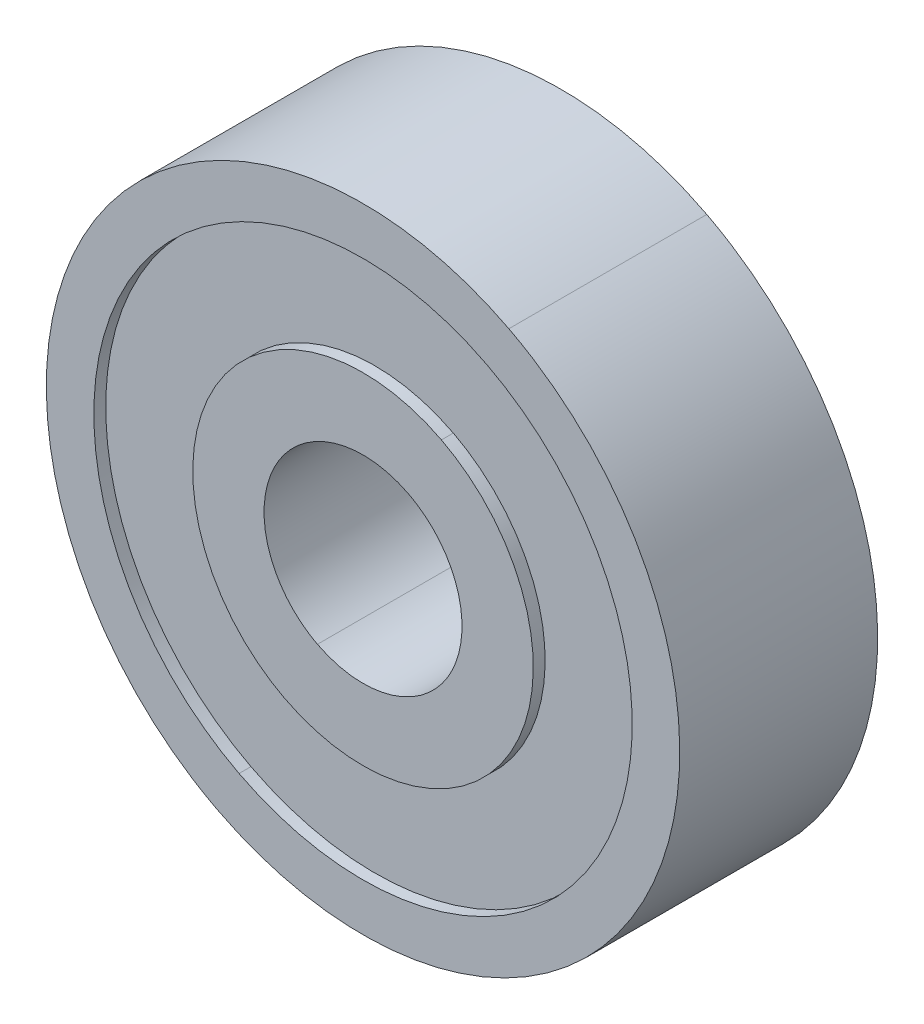
ISO-10303-21;
HEADER;
FILE_DESCRIPTION(('STEP AP214'),'2;1');
FILE_NAME('part.step','',(''),(''),'','','');
FILE_SCHEMA(('AUTOMOTIVE_DESIGN { 1 0 10303 214 1 1 1 1 }'));
ENDSEC;
DATA;
#1=APPLICATION_CONTEXT('core data for automotive mechanical design processes');
#2=APPLICATION_PROTOCOL_DEFINITION('international standard','automotive_design',2000,#1);
#3=PRODUCT_CONTEXT('',#1,'mechanical');
#4=PRODUCT('Part','Part','',(#3));
#5=PRODUCT_RELATED_PRODUCT_CATEGORY('part','',(#4));
#6=PRODUCT_DEFINITION_FORMATION('','',#4);
#7=PRODUCT_DEFINITION_CONTEXT('part definition',#1,'design');
#8=PRODUCT_DEFINITION('design','',#6,#7);
#9=PRODUCT_DEFINITION_SHAPE('','',#8);
#10=(LENGTH_UNIT() NAMED_UNIT(*) SI_UNIT(.MILLI.,.METRE.));
#11=(NAMED_UNIT(*) PLANE_ANGLE_UNIT() SI_UNIT($,.RADIAN.));
#12=(NAMED_UNIT(*) SI_UNIT($,.STERADIAN.) SOLID_ANGLE_UNIT());
#13=UNCERTAINTY_MEASURE_WITH_UNIT(LENGTH_MEASURE(1.E-05),#10,'distance_accuracy_value','');
#14=(GEOMETRIC_REPRESENTATION_CONTEXT(3) GLOBAL_UNCERTAINTY_ASSIGNED_CONTEXT((#13)) GLOBAL_UNIT_ASSIGNED_CONTEXT((#10,
#11,#12)) REPRESENTATION_CONTEXT('',''));
#15=CARTESIAN_POINT('',(0.,0.,0.));
#16=DIRECTION('',(0.,0.,1.));
#17=DIRECTION('',(1.,0.,0.));
#18=AXIS2_PLACEMENT_3D('',#15,#16,#17);
#19=CARTESIAN_POINT('',(168.364061599872,-426.296506317955,250.381305856301));
#20=CARTESIAN_POINT('',(170.583226360934,-427.447726437334,250.381305856301));
#21=CARTESIAN_POINT('',(171.734446480313,-425.228561676273,250.381305856301));
#22=CARTESIAN_POINT('',(172.885666599692,-423.009396915211,250.381305856301));
#23=CARTESIAN_POINT('',(170.666501838631,-421.858176795832,250.381305856301));
#24=CARTESIAN_POINT('',(168.364061599872,-426.296506317955,255.381305856301));
#25=CARTESIAN_POINT('',(170.583226360934,-427.447726437334,255.381305856301));
#26=CARTESIAN_POINT('',(171.734446480313,-425.228561676273,255.381305856301));
#27=CARTESIAN_POINT('',(172.885666599692,-423.009396915211,255.381305856301));
#28=CARTESIAN_POINT('',(170.666501838631,-421.858176795832,255.381305856301));
#29=(BOUNDED_SURFACE() B_SPLINE_SURFACE(1,2,((#19,#20,#21,#22,#23),(#24,#25,#26,#27,#28)),
.UNSPECIFIED.,.F.,.F.,.F.) B_SPLINE_SURFACE_WITH_KNOTS((2,2),(3,2,3),(-2.5,2.5),
(1.5707963267949,3.14159265358979,4.71238898038469),
.UNSPECIFIED.) GEOMETRIC_REPRESENTATION_ITEM() RATIONAL_B_SPLINE_SURFACE(((1.,0.707106781186548,
1.,0.707106781186548,1.),(1.,0.707106781186548,1.,0.707106781186548,1.))) REPRESENTATION_ITEM('') SURFACE());
#30=CARTESIAN_POINT('',(170.666501838631,-421.858176795832,250.381305856301));
#31=CARTESIAN_POINT('',(170.666501838631,-421.858176795832,255.381305856301));
#32=(BOUNDED_CURVE() B_SPLINE_CURVE(1,(#30,#31),.UNSPECIFIED.,.F.,
.F.) B_SPLINE_CURVE_WITH_KNOTS((2,2),(0.,5.),
.UNSPECIFIED.) CURVE() GEOMETRIC_REPRESENTATION_ITEM() RATIONAL_B_SPLINE_CURVE((1.,1.)) REPRESENTATION_ITEM(''));
#33=CARTESIAN_POINT('',(170.666501838631,-421.858176795832,250.381305856301));
#34=VERTEX_POINT('',#33);
#35=CARTESIAN_POINT('',(170.666501838631,-421.858176795832,255.381305856301));
#36=VERTEX_POINT('',#35);
#37=EDGE_CURVE('E56',#34,#36,#32,.T.);
#38=CARTESIAN_POINT('',(168.364061599872,-426.296506317955,250.381305856301));
#39=CARTESIAN_POINT('',(170.583226360934,-427.447726437334,250.381305856301));
#40=CARTESIAN_POINT('',(171.734446480313,-425.228561676273,250.381305856301));
#41=CARTESIAN_POINT('',(172.885666599692,-423.009396915212,250.381305856301));
#42=CARTESIAN_POINT('',(170.666501838631,-421.858176795832,250.381305856301));
#43=(BOUNDED_CURVE() B_SPLINE_CURVE(2,(#38,#39,#40,#41,#42),.UNSPECIFIED.,.F.,
.F.) B_SPLINE_CURVE_WITH_KNOTS((3,2,3),(0.,3.92699081698724,7.85398163397448),
.UNSPECIFIED.) CURVE() GEOMETRIC_REPRESENTATION_ITEM() RATIONAL_B_SPLINE_CURVE((1.,
0.707106781186548,1.,0.707106781186548,1.)) REPRESENTATION_ITEM(''));
#44=CARTESIAN_POINT('',(168.364061599872,-426.296506317955,250.381305856301));
#45=VERTEX_POINT('',#44);
#46=EDGE_CURVE('E191',#45,#34,#43,.T.);
#47=CARTESIAN_POINT('',(168.364061599872,-426.296506317955,250.381305856301));
#48=CARTESIAN_POINT('',(168.364061599872,-426.296506317955,255.381305856301));
#49=(BOUNDED_CURVE() B_SPLINE_CURVE(1,(#47,#48),.UNSPECIFIED.,.F.,
.F.) B_SPLINE_CURVE_WITH_KNOTS((2,2),(0.,5.),
.UNSPECIFIED.) CURVE() GEOMETRIC_REPRESENTATION_ITEM() RATIONAL_B_SPLINE_CURVE((1.,1.)) REPRESENTATION_ITEM(''));
#50=CARTESIAN_POINT('',(168.364061599872,-426.296506317955,255.381305856301));
#51=VERTEX_POINT('',#50);
#52=EDGE_CURVE('E11',#45,#51,#49,.T.);
#53=CARTESIAN_POINT('',(168.364061599872,-426.296506317955,255.381305856301));
#54=CARTESIAN_POINT('',(170.583226360934,-427.447726437334,255.381305856301));
#55=CARTESIAN_POINT('',(171.734446480313,-425.228561676273,255.381305856301));
#56=CARTESIAN_POINT('',(172.885666599692,-423.009396915212,255.381305856301));
#57=CARTESIAN_POINT('',(170.666501838631,-421.858176795832,255.381305856301));
#58=(BOUNDED_CURVE() B_SPLINE_CURVE(2,(#53,#54,#55,#56,#57),.UNSPECIFIED.,.F.,
.F.) B_SPLINE_CURVE_WITH_KNOTS((3,2,3),(0.,3.92699081698724,7.85398163397448),
.UNSPECIFIED.) CURVE() GEOMETRIC_REPRESENTATION_ITEM() RATIONAL_B_SPLINE_CURVE((1.,
0.707106781186548,1.,0.707106781186548,1.)) REPRESENTATION_ITEM(''));
#59=EDGE_CURVE('E469',#51,#36,#58,.T.);
#60=ORIENTED_EDGE('',*,*,#37,.F.);
#61=ORIENTED_EDGE('',*,*,#46,.F.);
#62=ORIENTED_EDGE('',*,*,#52,.T.);
#63=ORIENTED_EDGE('',*,*,#59,.T.);
#64=EDGE_LOOP('',(#60,#61,#62,#63));
#65=FACE_BOUND('',#64,.T.);
#66=ADVANCED_FACE('F51',(#65),#29,.T.);
#67=CARTESIAN_POINT('',(167.535183113919,-427.894304945919,255.081305856301));
#68=CARTESIAN_POINT('',(167.535183113919,-427.894304945919,255.381305856301));
#69=CARTESIAN_POINT('',(171.352146502945,-429.874403551251,255.081305856301));
#70=CARTESIAN_POINT('',(171.352146502945,-429.874403551251,255.381305856301));
#71=CARTESIAN_POINT('',(173.332245108277,-426.057440162226,255.081305856301));
#72=CARTESIAN_POINT('',(173.332245108277,-426.057440162226,255.381305856301));
#73=CARTESIAN_POINT('',(175.31234371361,-422.2404767732,255.081305856301));
#74=CARTESIAN_POINT('',(175.31234371361,-422.2404767732,255.381305856301));
#75=CARTESIAN_POINT('',(171.495380324584,-420.260378167868,255.081305856301));
#76=CARTESIAN_POINT('',(171.495380324584,-420.260378167868,255.381305856301));
#77=(BOUNDED_SURFACE() B_SPLINE_SURFACE(2,1,((#67,#68),(#69,#70),(#71,#72),(#73,#74),(#75,#76)),
.UNSPECIFIED.,.F.,.F.,.F.) B_SPLINE_SURFACE_WITH_KNOTS((3,2,3),(2,2),(1.5707963267949,
3.14159265358979,4.71238898038469),(2.2,2.5),
.UNSPECIFIED.) GEOMETRIC_REPRESENTATION_ITEM() RATIONAL_B_SPLINE_SURFACE(((1.,1.),
(0.707106781186548,0.707106781186548),(1.,1.),(0.707106781186548,0.707106781186548),(1.,1.))) REPRESENTATION_ITEM('') SURFACE());
#78=CARTESIAN_POINT('',(171.495380324584,-420.260378167868,255.081305856301));
#79=CARTESIAN_POINT('',(171.495380324584,-420.260378167868,255.381305856301));
#80=(BOUNDED_CURVE() B_SPLINE_CURVE(1,(#78,#79),.UNSPECIFIED.,.F.,
.F.) B_SPLINE_CURVE_WITH_KNOTS((2,2),(0.,0.300000000000011),
.UNSPECIFIED.) CURVE() GEOMETRIC_REPRESENTATION_ITEM() RATIONAL_B_SPLINE_CURVE((1.,1.)) REPRESENTATION_ITEM(''));
#81=CARTESIAN_POINT('',(171.495380324584,-420.260378167868,255.081305856301));
#82=VERTEX_POINT('',#81);
#83=CARTESIAN_POINT('',(171.495380324584,-420.260378167868,255.381305856301));
#84=VERTEX_POINT('',#83);
#85=EDGE_CURVE('E402',#82,#84,#80,.T.);
#86=CARTESIAN_POINT('',(167.535183113919,-427.894304945919,255.381305856301));
#87=CARTESIAN_POINT('',(171.352146502945,-429.874403551251,255.381305856301));
#88=CARTESIAN_POINT('',(173.332245108277,-426.057440162226,255.381305856301));
#89=CARTESIAN_POINT('',(175.31234371361,-422.2404767732,255.381305856301));
#90=CARTESIAN_POINT('',(171.495380324584,-420.260378167868,255.381305856301));
#91=(BOUNDED_CURVE() B_SPLINE_CURVE(2,(#86,#87,#88,#89,#90),.UNSPECIFIED.,.F.,
.F.) B_SPLINE_CURVE_WITH_KNOTS((3,2,3),(0.,6.75442420521806,13.5088484104361),
.UNSPECIFIED.) CURVE() GEOMETRIC_REPRESENTATION_ITEM() RATIONAL_B_SPLINE_CURVE((1.,
0.707106781186548,1.,0.707106781186548,1.)) REPRESENTATION_ITEM(''));
#92=CARTESIAN_POINT('',(167.535183113919,-427.894304945919,255.381305856301));
#93=VERTEX_POINT('',#92);
#94=EDGE_CURVE('E454',#93,#84,#91,.T.);
#95=CARTESIAN_POINT('',(167.535183113919,-427.894304945919,255.081305856301));
#96=CARTESIAN_POINT('',(167.535183113919,-427.894304945919,255.381305856301));
#97=(BOUNDED_CURVE() B_SPLINE_CURVE(1,(#95,#96),.UNSPECIFIED.,.F.,
.F.) B_SPLINE_CURVE_WITH_KNOTS((2,2),(0.,0.300000000000011),
.UNSPECIFIED.) CURVE() GEOMETRIC_REPRESENTATION_ITEM() RATIONAL_B_SPLINE_CURVE((1.,1.)) REPRESENTATION_ITEM(''));
#98=CARTESIAN_POINT('',(167.535183113919,-427.894304945919,255.081305856301));
#99=VERTEX_POINT('',#98);
#100=EDGE_CURVE('E436',#99,#93,#97,.T.);
#101=CARTESIAN_POINT('',(167.535183113919,-427.894304945919,255.081305856301));
#102=CARTESIAN_POINT('',(171.352146502945,-429.874403551251,255.081305856301));
#103=CARTESIAN_POINT('',(173.332245108277,-426.057440162226,255.081305856301));
#104=CARTESIAN_POINT('',(175.31234371361,-422.2404767732,255.081305856301));
#105=CARTESIAN_POINT('',(171.495380324584,-420.260378167868,255.081305856301));
#106=(BOUNDED_CURVE() B_SPLINE_CURVE(2,(#101,#102,#103,#104,#105),.UNSPECIFIED.,.F.,
.F.) B_SPLINE_CURVE_WITH_KNOTS((3,2,3),(0.,6.75442420521806,13.5088484104361),
.UNSPECIFIED.) CURVE() GEOMETRIC_REPRESENTATION_ITEM() RATIONAL_B_SPLINE_CURVE((1.,
0.707106781186548,1.,0.707106781186548,1.)) REPRESENTATION_ITEM(''));
#107=EDGE_CURVE('E393',#99,#82,#106,.T.);
#108=ORIENTED_EDGE('',*,*,#85,.T.);
#109=ORIENTED_EDGE('',*,*,#94,.F.);
#110=ORIENTED_EDGE('',*,*,#100,.F.);
#111=ORIENTED_EDGE('',*,*,#107,.T.);
#112=EDGE_LOOP('',(#108,#109,#110,#111));
#113=FACE_BOUND('',#112,.T.);
#114=ADVANCED_FACE('F496',(#113),#77,.T.);
#115=CARTESIAN_POINT('',(166.38396299454,-430.11346970698,255.081305856301));
#116=CARTESIAN_POINT('',(172.420091144627,-433.244788431692,255.081305856301));
#117=CARTESIAN_POINT('',(175.551409869339,-427.208660281605,255.081305856301));
#118=CARTESIAN_POINT('',(178.68272859405,-421.172532131518,255.081305856301));
#119=CARTESIAN_POINT('',(172.646600443963,-418.041213406807,255.081305856301));
#120=CARTESIAN_POINT('',(166.38396299454,-430.11346970698,255.381305856301));
#121=CARTESIAN_POINT('',(172.420091144627,-433.244788431692,255.381305856301));
#122=CARTESIAN_POINT('',(175.551409869339,-427.208660281605,255.381305856301));
#123=CARTESIAN_POINT('',(178.68272859405,-421.172532131518,255.381305856301));
#124=CARTESIAN_POINT('',(172.646600443963,-418.041213406807,255.381305856301));
#125=(BOUNDED_SURFACE() B_SPLINE_SURFACE(1,2,((#115,#116,#117,#118,#119),(#120,#121,#122,#123,
#124)),.UNSPECIFIED.,.F.,.F.,.F.) B_SPLINE_SURFACE_WITH_KNOTS((2,2),(3,2,3),(2.2,2.5),
(1.5707963267949,3.14159265358979,4.71238898038469),
.UNSPECIFIED.) GEOMETRIC_REPRESENTATION_ITEM() RATIONAL_B_SPLINE_SURFACE(((1.,0.707106781186548,
1.,0.707106781186548,1.),(1.,0.707106781186548,1.,0.707106781186548,1.))) REPRESENTATION_ITEM('') SURFACE());
#126=CARTESIAN_POINT('',(172.646600443963,-418.041213406807,255.081305856301));
#127=CARTESIAN_POINT('',(172.646600443963,-418.041213406807,255.381305856301));
#128=(BOUNDED_CURVE() B_SPLINE_CURVE(1,(#126,#127),.UNSPECIFIED.,.F.,
.F.) B_SPLINE_CURVE_WITH_KNOTS((2,2),(0.,0.300000000000011),
.UNSPECIFIED.) CURVE() GEOMETRIC_REPRESENTATION_ITEM() RATIONAL_B_SPLINE_CURVE((1.,1.)) REPRESENTATION_ITEM(''));
#129=CARTESIAN_POINT('',(172.646600443963,-418.041213406807,255.081305856301));
#130=VERTEX_POINT('',#129);
#131=CARTESIAN_POINT('',(172.646600443963,-418.041213406807,255.381305856301));
#132=VERTEX_POINT('',#131);
#133=EDGE_CURVE('E376',#130,#132,#128,.T.);
#134=CARTESIAN_POINT('',(166.38396299454,-430.11346970698,255.081305856301));
#135=CARTESIAN_POINT('',(172.420091144627,-433.244788431692,255.081305856301));
#136=CARTESIAN_POINT('',(175.551409869338,-427.208660281605,255.081305856301));
#137=CARTESIAN_POINT('',(178.68272859405,-421.172532131518,255.081305856301));
#138=CARTESIAN_POINT('',(172.646600443963,-418.041213406807,255.081305856301));
#139=(BOUNDED_CURVE() B_SPLINE_CURVE(2,(#134,#135,#136,#137,#138),.UNSPECIFIED.,.F.,
.F.) B_SPLINE_CURVE_WITH_KNOTS((3,2,3),(0.,10.6814150222053,21.3628300444106),
.UNSPECIFIED.) CURVE() GEOMETRIC_REPRESENTATION_ITEM() RATIONAL_B_SPLINE_CURVE((1.,
0.707106781186548,1.,0.707106781186548,1.)) REPRESENTATION_ITEM(''));
#140=CARTESIAN_POINT('',(166.38396299454,-430.11346970698,255.081305856301));
#141=VERTEX_POINT('',#140);
#142=EDGE_CURVE('E412',#141,#130,#139,.T.);
#143=CARTESIAN_POINT('',(166.38396299454,-430.11346970698,255.081305856301));
#144=CARTESIAN_POINT('',(166.38396299454,-430.11346970698,255.381305856301));
#145=(BOUNDED_CURVE() B_SPLINE_CURVE(1,(#143,#144),.UNSPECIFIED.,.F.,
.F.) B_SPLINE_CURVE_WITH_KNOTS((2,2),(0.,0.300000000000011),
.UNSPECIFIED.) CURVE() GEOMETRIC_REPRESENTATION_ITEM() RATIONAL_B_SPLINE_CURVE((1.,1.)) REPRESENTATION_ITEM(''));
#146=CARTESIAN_POINT('',(166.38396299454,-430.11346970698,255.381305856301));
#147=VERTEX_POINT('',#146);
#148=EDGE_CURVE('E384',#141,#147,#145,.T.);
#149=CARTESIAN_POINT('',(166.38396299454,-430.11346970698,255.381305856301));
#150=CARTESIAN_POINT('',(172.420091144627,-433.244788431692,255.381305856301));
#151=CARTESIAN_POINT('',(175.551409869338,-427.208660281605,255.381305856301));
#152=CARTESIAN_POINT('',(178.68272859405,-421.172532131518,255.381305856301));
#153=CARTESIAN_POINT('',(172.646600443963,-418.041213406807,255.381305856301));
#154=(BOUNDED_CURVE() B_SPLINE_CURVE(2,(#149,#150,#151,#152,#153),.UNSPECIFIED.,.F.,
.F.) B_SPLINE_CURVE_WITH_KNOTS((3,2,3),(0.,10.6814150222053,21.3628300444106),
.UNSPECIFIED.) CURVE() GEOMETRIC_REPRESENTATION_ITEM() RATIONAL_B_SPLINE_CURVE((1.,
0.707106781186548,1.,0.707106781186548,1.)) REPRESENTATION_ITEM(''));
#155=EDGE_CURVE('E367',#147,#132,#154,.T.);
#156=ORIENTED_EDGE('',*,*,#133,.F.);
#157=ORIENTED_EDGE('',*,*,#142,.F.);
#158=ORIENTED_EDGE('',*,*,#148,.T.);
#159=ORIENTED_EDGE('',*,*,#155,.T.);
#160=EDGE_LOOP('',(#156,#157,#158,#159));
#161=FACE_BOUND('',#160,.T.);
#162=ADVANCED_FACE('F503',(#161),#125,.T.);
#163=CARTESIAN_POINT('',(165.831377337238,-431.17866879229,250.381305856301));
#164=CARTESIAN_POINT('',(165.831377337238,-431.17866879229,255.381305856301));
#165=CARTESIAN_POINT('',(172.932704572634,-434.862573174304,250.381305856301));
#166=CARTESIAN_POINT('',(172.932704572634,-434.862573174304,255.381305856301));
#167=CARTESIAN_POINT('',(176.616608954648,-427.761245938907,250.381305856301));
#168=CARTESIAN_POINT('',(176.616608954648,-427.761245938907,255.381305856301));
#169=CARTESIAN_POINT('',(180.300513336662,-420.659918703511,250.381305856301));
#170=CARTESIAN_POINT('',(180.300513336662,-420.659918703511,255.381305856301));
#171=CARTESIAN_POINT('',(173.199186101265,-416.976014321497,250.381305856301));
#172=CARTESIAN_POINT('',(173.199186101265,-416.976014321497,255.381305856301));
#173=(BOUNDED_SURFACE() B_SPLINE_SURFACE(2,1,((#163,#164),(#165,#166),(#167,#168),(#169,#170),
(#171,#172)),.UNSPECIFIED.,.F.,.F.,.F.) B_SPLINE_SURFACE_WITH_KNOTS((3,2,3),(2,2),
(1.5707963267949,3.14159265358979,4.71238898038469),(-2.5,2.5),
.UNSPECIFIED.) GEOMETRIC_REPRESENTATION_ITEM() RATIONAL_B_SPLINE_SURFACE(((1.,1.),
(0.707106781186548,0.707106781186548),(1.,1.),(0.707106781186548,0.707106781186548),(1.,1.))) REPRESENTATION_ITEM('') SURFACE());
#174=CARTESIAN_POINT('',(173.199186101265,-416.976014321497,250.381305856301));
#175=CARTESIAN_POINT('',(173.199186101265,-416.976014321497,255.381305856301));
#176=(BOUNDED_CURVE() B_SPLINE_CURVE(1,(#174,#175),.UNSPECIFIED.,.F.,
.F.) B_SPLINE_CURVE_WITH_KNOTS((2,2),(0.,5.),
.UNSPECIFIED.) CURVE() GEOMETRIC_REPRESENTATION_ITEM() RATIONAL_B_SPLINE_CURVE((1.,1.)) REPRESENTATION_ITEM(''));
#177=CARTESIAN_POINT('',(173.199186101265,-416.976014321497,250.381305856301));
#178=VERTEX_POINT('',#177);
#179=CARTESIAN_POINT('',(173.199186101265,-416.976014321497,255.381305856301));
#180=VERTEX_POINT('',#179);
#181=EDGE_CURVE('E301',#178,#180,#176,.T.);
#182=CARTESIAN_POINT('',(165.831377337238,-431.17866879229,255.381305856301));
#183=CARTESIAN_POINT('',(172.932704572634,-434.862573174304,255.381305856301));
#184=CARTESIAN_POINT('',(176.616608954648,-427.761245938907,255.381305856301));
#185=CARTESIAN_POINT('',(180.300513336662,-420.659918703511,255.381305856301));
#186=CARTESIAN_POINT('',(173.199186101265,-416.976014321497,255.381305856301));
#187=(BOUNDED_CURVE() B_SPLINE_CURVE(2,(#182,#183,#184,#185,#186),.UNSPECIFIED.,.F.,
.F.) B_SPLINE_CURVE_WITH_KNOTS((3,2,3),(0.,12.5663706143592,25.1327412287183),
.UNSPECIFIED.) CURVE() GEOMETRIC_REPRESENTATION_ITEM() RATIONAL_B_SPLINE_CURVE((1.,
0.707106781186548,1.,0.707106781186548,1.)) REPRESENTATION_ITEM(''));
#188=CARTESIAN_POINT('',(165.831377337238,-431.17866879229,255.381305856301));
#189=VERTEX_POINT('',#188);
#190=EDGE_CURVE('E350',#189,#180,#187,.T.);
#191=CARTESIAN_POINT('',(165.831377337238,-431.17866879229,250.381305856301));
#192=CARTESIAN_POINT('',(165.831377337238,-431.17866879229,255.381305856301));
#193=(BOUNDED_CURVE() B_SPLINE_CURVE(1,(#191,#192),.UNSPECIFIED.,.F.,
.F.) B_SPLINE_CURVE_WITH_KNOTS((2,2),(0.,5.),
.UNSPECIFIED.) CURVE() GEOMETRIC_REPRESENTATION_ITEM() RATIONAL_B_SPLINE_CURVE((1.,1.)) REPRESENTATION_ITEM(''));
#194=CARTESIAN_POINT('',(165.831377337238,-431.17866879229,250.381305856301));
#195=VERTEX_POINT('',#194);
#196=EDGE_CURVE('E332',#195,#189,#193,.T.);
#197=CARTESIAN_POINT('',(165.831377337238,-431.17866879229,250.381305856301));
#198=CARTESIAN_POINT('',(172.932704572634,-434.862573174304,250.381305856301));
#199=CARTESIAN_POINT('',(176.616608954648,-427.761245938907,250.381305856301));
#200=CARTESIAN_POINT('',(180.300513336662,-420.659918703511,250.381305856301));
#201=CARTESIAN_POINT('',(173.199186101265,-416.976014321497,250.381305856301));
#202=(BOUNDED_CURVE() B_SPLINE_CURVE(2,(#197,#198,#199,#200,#201),.UNSPECIFIED.,.F.,
.F.) B_SPLINE_CURVE_WITH_KNOTS((3,2,3),(0.,12.5663706143592,25.1327412287183),
.UNSPECIFIED.) CURVE() GEOMETRIC_REPRESENTATION_ITEM() RATIONAL_B_SPLINE_CURVE((1.,
0.707106781186548,1.,0.707106781186548,1.)) REPRESENTATION_ITEM(''));
#203=EDGE_CURVE('E302',#195,#178,#202,.T.);
#204=ORIENTED_EDGE('',*,*,#181,.T.);
#205=ORIENTED_EDGE('',*,*,#190,.F.);
#206=ORIENTED_EDGE('',*,*,#196,.F.);
#207=ORIENTED_EDGE('',*,*,#203,.T.);
#208=EDGE_LOOP('',(#204,#205,#206,#207));
#209=FACE_BOUND('',#208,.T.);
#210=ADVANCED_FACE('F520',(#209),#173,.T.);
#211=CARTESIAN_POINT('',(166.38396299454,-430.11346970698,250.381305856301));
#212=CARTESIAN_POINT('',(172.420091144627,-433.244788431692,250.381305856301));
#213=CARTESIAN_POINT('',(175.551409869338,-427.208660281605,250.381305856301));
#214=CARTESIAN_POINT('',(178.68272859405,-421.172532131518,250.381305856301));
#215=CARTESIAN_POINT('',(172.646600443963,-418.041213406807,250.381305856301));
#216=CARTESIAN_POINT('',(166.38396299454,-430.11346970698,250.681305856301));
#217=CARTESIAN_POINT('',(172.420091144627,-433.244788431692,250.681305856301));
#218=CARTESIAN_POINT('',(175.551409869338,-427.208660281605,250.681305856301));
#219=CARTESIAN_POINT('',(178.68272859405,-421.172532131518,250.681305856301));
#220=CARTESIAN_POINT('',(172.646600443963,-418.041213406807,250.681305856301));
#221=(BOUNDED_SURFACE() B_SPLINE_SURFACE(1,2,((#211,#212,#213,#214,#215),(#216,#217,#218,#219,
#220)),.UNSPECIFIED.,.F.,.F.,.F.) B_SPLINE_SURFACE_WITH_KNOTS((2,2),(3,2,3),(-2.5,-2.2),
(1.5707963267949,3.14159265358979,4.71238898038469),
.UNSPECIFIED.) GEOMETRIC_REPRESENTATION_ITEM() RATIONAL_B_SPLINE_SURFACE(((1.,0.707106781186548,
1.,0.707106781186548,1.),(1.,0.707106781186548,1.,0.707106781186548,1.))) REPRESENTATION_ITEM('') SURFACE());
#222=CARTESIAN_POINT('',(172.646600443963,-418.041213406807,250.381305856301));
#223=CARTESIAN_POINT('',(172.646600443963,-418.041213406807,250.681305856301));
#224=(BOUNDED_CURVE() B_SPLINE_CURVE(1,(#222,#223),.UNSPECIFIED.,.F.,
.F.) B_SPLINE_CURVE_WITH_KNOTS((2,2),(0.,0.300000000000011),
.UNSPECIFIED.) CURVE() GEOMETRIC_REPRESENTATION_ITEM() RATIONAL_B_SPLINE_CURVE((1.,1.)) REPRESENTATION_ITEM(''));
#225=CARTESIAN_POINT('',(172.646600443963,-418.041213406807,250.381305856301));
#226=VERTEX_POINT('',#225);
#227=CARTESIAN_POINT('',(172.646600443963,-418.041213406807,250.681305856301));
#228=VERTEX_POINT('',#227);
#229=EDGE_CURVE('E223',#226,#228,#224,.T.);
#230=CARTESIAN_POINT('',(166.38396299454,-430.11346970698,250.381305856301));
#231=CARTESIAN_POINT('',(172.420091144627,-433.244788431692,250.381305856301));
#232=CARTESIAN_POINT('',(175.551409869338,-427.208660281605,250.381305856301));
#233=CARTESIAN_POINT('',(178.68272859405,-421.172532131518,250.381305856301));
#234=CARTESIAN_POINT('',(172.646600443963,-418.041213406807,250.381305856301));
#235=(BOUNDED_CURVE() B_SPLINE_CURVE(2,(#230,#231,#232,#233,#234),.UNSPECIFIED.,.F.,
.F.) B_SPLINE_CURVE_WITH_KNOTS((3,2,3),(0.,10.6814150222053,21.3628300444106),
.UNSPECIFIED.) CURVE() GEOMETRIC_REPRESENTATION_ITEM() RATIONAL_B_SPLINE_CURVE((1.,
0.707106781186548,1.,0.707106781186548,1.)) REPRESENTATION_ITEM(''));
#236=CARTESIAN_POINT('',(166.38396299454,-430.11346970698,250.381305856301));
#237=VERTEX_POINT('',#236);
#238=EDGE_CURVE('E293',#237,#226,#235,.T.);
#239=CARTESIAN_POINT('',(166.38396299454,-430.11346970698,250.381305856301));
#240=CARTESIAN_POINT('',(166.38396299454,-430.11346970698,250.681305856301));
#241=(BOUNDED_CURVE() B_SPLINE_CURVE(1,(#239,#240),.UNSPECIFIED.,.F.,
.F.) B_SPLINE_CURVE_WITH_KNOTS((2,2),(0.,0.300000000000011),
.UNSPECIFIED.) CURVE() GEOMETRIC_REPRESENTATION_ITEM() RATIONAL_B_SPLINE_CURVE((1.,1.)) REPRESENTATION_ITEM(''));
#242=CARTESIAN_POINT('',(166.38396299454,-430.11346970698,250.681305856301));
#243=VERTEX_POINT('',#242);
#244=EDGE_CURVE('E214',#237,#243,#241,.T.);
#245=CARTESIAN_POINT('',(166.38396299454,-430.11346970698,250.681305856301));
#246=CARTESIAN_POINT('',(172.420091144627,-433.244788431692,250.681305856301));
#247=CARTESIAN_POINT('',(175.551409869338,-427.208660281605,250.681305856301));
#248=CARTESIAN_POINT('',(178.68272859405,-421.172532131518,250.681305856301));
#249=CARTESIAN_POINT('',(172.646600443963,-418.041213406807,250.681305856301));
#250=(BOUNDED_CURVE() B_SPLINE_CURVE(2,(#245,#246,#247,#248,#249),.UNSPECIFIED.,.F.,
.F.) B_SPLINE_CURVE_WITH_KNOTS((3,2,3),(0.,10.6814150222053,21.3628300444106),
.UNSPECIFIED.) CURVE() GEOMETRIC_REPRESENTATION_ITEM() RATIONAL_B_SPLINE_CURVE((1.,
0.707106781186548,1.,0.707106781186548,1.)) REPRESENTATION_ITEM(''));
#251=EDGE_CURVE('E239',#243,#228,#250,.T.);
#252=ORIENTED_EDGE('',*,*,#229,.F.);
#253=ORIENTED_EDGE('',*,*,#238,.F.);
#254=ORIENTED_EDGE('',*,*,#244,.T.);
#255=ORIENTED_EDGE('',*,*,#251,.T.);
#256=EDGE_LOOP('',(#252,#253,#254,#255));
#257=FACE_BOUND('',#256,.T.);
#258=ADVANCED_FACE('F512',(#257),#221,.T.);
#259=CARTESIAN_POINT('',(167.535183113919,-427.894304945919,250.381305856301));
#260=CARTESIAN_POINT('',(167.535183113919,-427.894304945919,250.681305856301));
#261=CARTESIAN_POINT('',(171.352146502945,-429.874403551251,250.381305856301));
#262=CARTESIAN_POINT('',(171.352146502945,-429.874403551251,250.681305856301));
#263=CARTESIAN_POINT('',(173.332245108277,-426.057440162226,250.381305856301));
#264=CARTESIAN_POINT('',(173.332245108277,-426.057440162226,250.681305856301));
#265=CARTESIAN_POINT('',(175.31234371361,-422.2404767732,250.381305856301));
#266=CARTESIAN_POINT('',(175.31234371361,-422.2404767732,250.681305856301));
#267=CARTESIAN_POINT('',(171.495380324584,-420.260378167868,250.381305856301));
#268=CARTESIAN_POINT('',(171.495380324584,-420.260378167868,250.681305856301));
#269=(BOUNDED_SURFACE() B_SPLINE_SURFACE(2,1,((#259,#260),(#261,#262),(#263,#264),(#265,#266),
(#267,#268)),.UNSPECIFIED.,.F.,.F.,.F.) B_SPLINE_SURFACE_WITH_KNOTS((3,2,3),(2,2),
(1.5707963267949,3.14159265358979,4.71238898038469),(-2.5,-2.2),
.UNSPECIFIED.) GEOMETRIC_REPRESENTATION_ITEM() RATIONAL_B_SPLINE_SURFACE(((1.,1.),
(0.707106781186548,0.707106781186548),(1.,1.),(0.707106781186548,0.707106781186548),(1.,1.))) REPRESENTATION_ITEM('') SURFACE());
#270=CARTESIAN_POINT('',(171.495380324584,-420.260378167868,250.381305856301));
#271=CARTESIAN_POINT('',(171.495380324584,-420.260378167868,250.681305856301));
#272=(BOUNDED_CURVE() B_SPLINE_CURVE(1,(#270,#271),.UNSPECIFIED.,.F.,
.F.) B_SPLINE_CURVE_WITH_KNOTS((2,2),(0.,0.300000000000011),
.UNSPECIFIED.) CURVE() GEOMETRIC_REPRESENTATION_ITEM() RATIONAL_B_SPLINE_CURVE((1.,1.)) REPRESENTATION_ITEM(''));
#273=CARTESIAN_POINT('',(171.495380324584,-420.260378167868,250.381305856301));
#274=VERTEX_POINT('',#273);
#275=CARTESIAN_POINT('',(171.495380324584,-420.260378167868,250.681305856301));
#276=VERTEX_POINT('',#275);
#277=EDGE_CURVE('E173',#274,#276,#272,.T.);
#278=CARTESIAN_POINT('',(167.535183113919,-427.894304945919,250.681305856301));
#279=CARTESIAN_POINT('',(171.352146502945,-429.874403551251,250.681305856301));
#280=CARTESIAN_POINT('',(173.332245108277,-426.057440162226,250.681305856301));
#281=CARTESIAN_POINT('',(175.31234371361,-422.2404767732,250.681305856301));
#282=CARTESIAN_POINT('',(171.495380324584,-420.260378167868,250.681305856301));
#283=(BOUNDED_CURVE() B_SPLINE_CURVE(2,(#278,#279,#280,#281,#282),.UNSPECIFIED.,.F.,
.F.) B_SPLINE_CURVE_WITH_KNOTS((3,2,3),(0.,6.75442420521806,13.5088484104361),
.UNSPECIFIED.) CURVE() GEOMETRIC_REPRESENTATION_ITEM() RATIONAL_B_SPLINE_CURVE((1.,
0.707106781186548,1.,0.707106781186548,1.)) REPRESENTATION_ITEM(''));
#284=CARTESIAN_POINT('',(167.535183113919,-427.894304945919,250.681305856301));
#285=VERTEX_POINT('',#284);
#286=EDGE_CURVE('E248',#285,#276,#283,.T.);
#287=CARTESIAN_POINT('',(167.535183113919,-427.894304945919,250.381305856301));
#288=CARTESIAN_POINT('',(167.535183113919,-427.894304945919,250.681305856301));
#289=(BOUNDED_CURVE() B_SPLINE_CURVE(1,(#287,#288),.UNSPECIFIED.,.F.,
.F.) B_SPLINE_CURVE_WITH_KNOTS((2,2),(0.,0.300000000000011),
.UNSPECIFIED.) CURVE() GEOMETRIC_REPRESENTATION_ITEM() RATIONAL_B_SPLINE_CURVE((1.,1.)) REPRESENTATION_ITEM(''));
#290=CARTESIAN_POINT('',(167.535183113919,-427.894304945919,250.381305856301));
#291=VERTEX_POINT('',#290);
#292=EDGE_CURVE('E183',#291,#285,#289,.T.);
#293=CARTESIAN_POINT('',(167.535183113919,-427.894304945919,250.381305856301));
#294=CARTESIAN_POINT('',(171.352146502945,-429.874403551251,250.381305856301));
#295=CARTESIAN_POINT('',(173.332245108277,-426.057440162226,250.381305856301));
#296=CARTESIAN_POINT('',(175.31234371361,-422.2404767732,250.381305856301));
#297=CARTESIAN_POINT('',(171.495380324584,-420.260378167868,250.381305856301));
#298=(BOUNDED_CURVE() B_SPLINE_CURVE(2,(#293,#294,#295,#296,#297),.UNSPECIFIED.,.F.,
.F.) B_SPLINE_CURVE_WITH_KNOTS((3,2,3),(0.,6.75442420521806,13.5088484104361),
.UNSPECIFIED.) CURVE() GEOMETRIC_REPRESENTATION_ITEM() RATIONAL_B_SPLINE_CURVE((1.,
0.707106781186548,1.,0.707106781186548,1.)) REPRESENTATION_ITEM(''));
#299=EDGE_CURVE('E187',#291,#274,#298,.T.);
#300=ORIENTED_EDGE('',*,*,#277,.T.);
#301=ORIENTED_EDGE('',*,*,#286,.F.);
#302=ORIENTED_EDGE('',*,*,#292,.F.);
#303=ORIENTED_EDGE('',*,*,#299,.T.);
#304=EDGE_LOOP('',(#300,#301,#302,#303));
#305=FACE_BOUND('',#304,.T.);
#306=ADVANCED_FACE('F188',(#305),#269,.T.);
#307=CARTESIAN_POINT('',(170.666501838631,-421.858176795832,250.381305856301));
#308=CARTESIAN_POINT('',(168.44733707757,-420.706956676453,250.381305856301));
#309=CARTESIAN_POINT('',(167.29611695819,-422.926121437514,250.381305856301));
#310=CARTESIAN_POINT('',(166.144896838811,-425.145286198576,250.381305856301));
#311=CARTESIAN_POINT('',(168.364061599872,-426.296506317955,250.381305856301));
#312=CARTESIAN_POINT('',(170.666501838631,-421.858176795832,255.381305856301));
#313=CARTESIAN_POINT('',(168.44733707757,-420.706956676453,255.381305856301));
#314=CARTESIAN_POINT('',(167.29611695819,-422.926121437514,255.381305856301));
#315=CARTESIAN_POINT('',(166.144896838811,-425.145286198576,255.381305856301));
#316=CARTESIAN_POINT('',(168.364061599872,-426.296506317955,255.381305856301));
#317=(BOUNDED_SURFACE() B_SPLINE_SURFACE(1,2,((#307,#308,#309,#310,#311),(#312,#313,#314,#315,
#316)),.UNSPECIFIED.,.F.,.F.,.F.) B_SPLINE_SURFACE_WITH_KNOTS((2,2),(3,2,3),(-2.5,2.5),
(1.5707963267949,3.14159265358979,4.71238898038469),
.UNSPECIFIED.) GEOMETRIC_REPRESENTATION_ITEM() RATIONAL_B_SPLINE_SURFACE(((1.,0.707106781186548,
1.,0.707106781186548,1.),(1.,0.707106781186548,1.,0.707106781186548,1.))) REPRESENTATION_ITEM('') SURFACE());
#318=CARTESIAN_POINT('',(170.666501838631,-421.858176795832,255.381305856301));
#319=CARTESIAN_POINT('',(168.44733707757,-420.706956676453,255.381305856301));
#320=CARTESIAN_POINT('',(167.29611695819,-422.926121437514,255.381305856301));
#321=CARTESIAN_POINT('',(166.144896838811,-425.145286198576,255.381305856301));
#322=CARTESIAN_POINT('',(168.364061599872,-426.296506317955,255.381305856301));
#323=(BOUNDED_CURVE() B_SPLINE_CURVE(2,(#318,#319,#320,#321,#322),.UNSPECIFIED.,.F.,
.F.) B_SPLINE_CURVE_WITH_KNOTS((3,2,3),(0.,3.92699081698724,7.85398163397448),
.UNSPECIFIED.) CURVE() GEOMETRIC_REPRESENTATION_ITEM() RATIONAL_B_SPLINE_CURVE((1.,
0.707106781186548,1.,0.707106781186548,1.)) REPRESENTATION_ITEM(''));
#324=EDGE_CURVE('E462',#36,#51,#323,.T.);
#325=CARTESIAN_POINT('',(170.666501838631,-421.858176795832,250.381305856301));
#326=CARTESIAN_POINT('',(168.44733707757,-420.706956676453,250.381305856301));
#327=CARTESIAN_POINT('',(167.29611695819,-422.926121437514,250.381305856301));
#328=CARTESIAN_POINT('',(166.144896838811,-425.145286198576,250.381305856301));
#329=CARTESIAN_POINT('',(168.364061599872,-426.296506317955,250.381305856301));
#330=(BOUNDED_CURVE() B_SPLINE_CURVE(2,(#325,#326,#327,#328,#329),.UNSPECIFIED.,.F.,
.F.) B_SPLINE_CURVE_WITH_KNOTS((3,2,3),(0.,3.92699081698724,7.85398163397448),
.UNSPECIFIED.) CURVE() GEOMETRIC_REPRESENTATION_ITEM() RATIONAL_B_SPLINE_CURVE((1.,
0.707106781186548,1.,0.707106781186548,1.)) REPRESENTATION_ITEM(''));
#331=EDGE_CURVE('E184',#34,#45,#330,.T.);
#332=ORIENTED_EDGE('',*,*,#37,.T.);
#333=ORIENTED_EDGE('',*,*,#324,.T.);
#334=ORIENTED_EDGE('',*,*,#52,.F.);
#335=ORIENTED_EDGE('',*,*,#331,.F.);
#336=EDGE_LOOP('',(#332,#333,#334,#335));
#337=FACE_BOUND('',#336,.T.);
#338=ADVANCED_FACE('F511',(#337),#317,.T.);
#339=CARTESIAN_POINT('',(167.678416935559,-418.280279562536,255.381305856301));
#340=DIRECTION('',(0.,0.,1.));
#341=DIRECTION('',(1.,0.,0.));
#342=AXIS2_PLACEMENT_3D('',#339,#340,#341);
#343=PLANE('',#342);
#344=ORIENTED_EDGE('',*,*,#324,.F.);
#345=ORIENTED_EDGE('',*,*,#59,.F.);
#346=EDGE_LOOP('',(#344,#345));
#347=FACE_BOUND('',#346,.T.);
#348=ORIENTED_EDGE('',*,*,#94,.T.);
#349=CARTESIAN_POINT('',(171.495380324584,-420.260378167868,255.381305856301));
#350=CARTESIAN_POINT('',(167.678416935559,-418.280279562536,255.381305856301));
#351=CARTESIAN_POINT('',(165.698318330226,-422.097242951561,255.381305856301));
#352=CARTESIAN_POINT('',(163.718219724894,-425.914206340587,255.381305856301));
#353=CARTESIAN_POINT('',(167.535183113919,-427.894304945919,255.381305856301));
#354=(BOUNDED_CURVE() B_SPLINE_CURVE(2,(#349,#350,#351,#352,#353),.UNSPECIFIED.,.F.,
.F.) B_SPLINE_CURVE_WITH_KNOTS((3,2,3),(0.,6.75442420521805,13.5088484104361),
.UNSPECIFIED.) CURVE() GEOMETRIC_REPRESENTATION_ITEM() RATIONAL_B_SPLINE_CURVE((1.,
0.707106781186548,1.,0.707106781186548,1.)) REPRESENTATION_ITEM(''));
#355=EDGE_CURVE('E445',#84,#93,#354,.T.);
#356=ORIENTED_EDGE('',*,*,#355,.T.);
#357=EDGE_LOOP('',(#348,#356));
#358=FACE_BOUND('',#357,.T.);
#359=ADVANCED_FACE('F526',(#347,#358),#343,.T.);
#360=CARTESIAN_POINT('',(171.495380324584,-420.260378167868,255.081305856301));
#361=CARTESIAN_POINT('',(171.495380324584,-420.260378167868,255.381305856301));
#362=CARTESIAN_POINT('',(167.678416935559,-418.280279562536,255.081305856301));
#363=CARTESIAN_POINT('',(167.678416935559,-418.280279562536,255.381305856301));
#364=CARTESIAN_POINT('',(165.698318330226,-422.097242951561,255.081305856301));
#365=CARTESIAN_POINT('',(165.698318330226,-422.097242951561,255.381305856301));
#366=CARTESIAN_POINT('',(163.718219724894,-425.914206340587,255.081305856301));
#367=CARTESIAN_POINT('',(163.718219724894,-425.914206340587,255.381305856301));
#368=CARTESIAN_POINT('',(167.535183113919,-427.894304945919,255.081305856301));
#369=CARTESIAN_POINT('',(167.535183113919,-427.894304945919,255.381305856301));
#370=(BOUNDED_SURFACE() B_SPLINE_SURFACE(2,1,((#360,#361),(#362,#363),(#364,#365),(#366,#367),
(#368,#369)),.UNSPECIFIED.,.F.,.F.,.F.) B_SPLINE_SURFACE_WITH_KNOTS((3,2,3),(2,2),
(1.5707963267949,3.14159265358979,4.71238898038469),(2.2,2.5),
.UNSPECIFIED.) GEOMETRIC_REPRESENTATION_ITEM() RATIONAL_B_SPLINE_SURFACE(((1.,1.),
(0.707106781186548,0.707106781186548),(1.,1.),(0.707106781186548,0.707106781186548),(1.,1.))) REPRESENTATION_ITEM('') SURFACE());
#371=CARTESIAN_POINT('',(171.495380324584,-420.260378167868,255.081305856301));
#372=CARTESIAN_POINT('',(167.678416935559,-418.280279562536,255.081305856301));
#373=CARTESIAN_POINT('',(165.698318330226,-422.097242951561,255.081305856301));
#374=CARTESIAN_POINT('',(163.718219724894,-425.914206340587,255.081305856301));
#375=CARTESIAN_POINT('',(167.535183113919,-427.894304945919,255.081305856301));
#376=(BOUNDED_CURVE() B_SPLINE_CURVE(2,(#371,#372,#373,#374,#375),.UNSPECIFIED.,.F.,
.F.) B_SPLINE_CURVE_WITH_KNOTS((3,2,3),(0.,6.75442420521805,13.5088484104361),
.UNSPECIFIED.) CURVE() GEOMETRIC_REPRESENTATION_ITEM() RATIONAL_B_SPLINE_CURVE((1.,
0.707106781186548,1.,0.707106781186548,1.)) REPRESENTATION_ITEM(''));
#377=EDGE_CURVE('E403',#82,#99,#376,.T.);
#378=ORIENTED_EDGE('',*,*,#85,.F.);
#379=ORIENTED_EDGE('',*,*,#377,.T.);
#380=ORIENTED_EDGE('',*,*,#100,.T.);
#381=ORIENTED_EDGE('',*,*,#355,.F.);
#382=EDGE_LOOP('',(#378,#379,#380,#381));
#383=FACE_BOUND('',#382,.T.);
#384=ADVANCED_FACE('F530',(#383),#370,.T.);
#385=CARTESIAN_POINT('',(166.610472293877,-414.909894682095,255.081305856301));
#386=DIRECTION('',(0.,0.,1.));
#387=DIRECTION('',(1.,0.,0.));
#388=AXIS2_PLACEMENT_3D('',#385,#386,#387);
#389=PLANE('',#388);
#390=ORIENTED_EDGE('',*,*,#377,.F.);
#391=ORIENTED_EDGE('',*,*,#107,.F.);
#392=EDGE_LOOP('',(#390,#391));
#393=FACE_BOUND('',#392,.T.);
#394=ORIENTED_EDGE('',*,*,#142,.T.);
#395=CARTESIAN_POINT('',(172.646600443963,-418.041213406807,255.081305856301));
#396=CARTESIAN_POINT('',(166.610472293877,-414.909894682095,255.081305856301));
#397=CARTESIAN_POINT('',(163.479153569165,-420.946022832182,255.081305856301));
#398=CARTESIAN_POINT('',(160.347834844453,-426.982150982269,255.081305856301));
#399=CARTESIAN_POINT('',(166.38396299454,-430.11346970698,255.081305856301));
#400=(BOUNDED_CURVE() B_SPLINE_CURVE(2,(#395,#396,#397,#398,#399),.UNSPECIFIED.,.F.,
.F.) B_SPLINE_CURVE_WITH_KNOTS((3,2,3),(0.,10.6814150222053,21.3628300444106),
.UNSPECIFIED.) CURVE() GEOMETRIC_REPRESENTATION_ITEM() RATIONAL_B_SPLINE_CURVE((1.,
0.707106781186547,1.,0.707106781186547,1.)) REPRESENTATION_ITEM(''));
#401=EDGE_CURVE('E392',#130,#141,#400,.T.);
#402=ORIENTED_EDGE('',*,*,#401,.T.);
#403=EDGE_LOOP('',(#394,#402));
#404=FACE_BOUND('',#403,.T.);
#405=ADVANCED_FACE('F547',(#393,#404),#389,.T.);
#406=CARTESIAN_POINT('',(172.646600443963,-418.041213406807,255.081305856301));
#407=CARTESIAN_POINT('',(166.610472293877,-414.909894682095,255.081305856301));
#408=CARTESIAN_POINT('',(163.479153569165,-420.946022832182,255.081305856301));
#409=CARTESIAN_POINT('',(160.347834844453,-426.982150982269,255.081305856301));
#410=CARTESIAN_POINT('',(166.38396299454,-430.11346970698,255.081305856301));
#411=CARTESIAN_POINT('',(172.646600443963,-418.041213406807,255.381305856301));
#412=CARTESIAN_POINT('',(166.610472293877,-414.909894682095,255.381305856301));
#413=CARTESIAN_POINT('',(163.479153569165,-420.946022832182,255.381305856301));
#414=CARTESIAN_POINT('',(160.347834844453,-426.982150982269,255.381305856301));
#415=CARTESIAN_POINT('',(166.38396299454,-430.11346970698,255.381305856301));
#416=(BOUNDED_SURFACE() B_SPLINE_SURFACE(1,2,((#406,#407,#408,#409,#410),(#411,#412,#413,#414,
#415)),.UNSPECIFIED.,.F.,.F.,.F.) B_SPLINE_SURFACE_WITH_KNOTS((2,2),(3,2,3),(2.2,2.5),
(1.5707963267949,3.14159265358979,4.71238898038469),
.UNSPECIFIED.) GEOMETRIC_REPRESENTATION_ITEM() RATIONAL_B_SPLINE_SURFACE(((1.,0.707106781186547,
1.,0.707106781186547,1.),(1.,0.707106781186547,1.,0.707106781186547,1.))) REPRESENTATION_ITEM('') SURFACE());
#417=CARTESIAN_POINT('',(172.646600443963,-418.041213406807,255.381305856301));
#418=CARTESIAN_POINT('',(166.610472293877,-414.909894682095,255.381305856301));
#419=CARTESIAN_POINT('',(163.479153569165,-420.946022832182,255.381305856301));
#420=CARTESIAN_POINT('',(160.347834844453,-426.982150982269,255.381305856301));
#421=CARTESIAN_POINT('',(166.38396299454,-430.11346970698,255.381305856301));
#422=(BOUNDED_CURVE() B_SPLINE_CURVE(2,(#417,#418,#419,#420,#421),.UNSPECIFIED.,.F.,
.F.) B_SPLINE_CURVE_WITH_KNOTS((3,2,3),(0.,10.6814150222053,21.3628300444106),
.UNSPECIFIED.) CURVE() GEOMETRIC_REPRESENTATION_ITEM() RATIONAL_B_SPLINE_CURVE((1.,
0.707106781186547,1.,0.707106781186547,1.)) REPRESENTATION_ITEM(''));
#423=EDGE_CURVE('E358',#132,#147,#422,.T.);
#424=ORIENTED_EDGE('',*,*,#133,.T.);
#425=ORIENTED_EDGE('',*,*,#423,.T.);
#426=ORIENTED_EDGE('',*,*,#148,.F.);
#427=ORIENTED_EDGE('',*,*,#401,.F.);
#428=EDGE_LOOP('',(#424,#425,#426,#427));
#429=FACE_BOUND('',#428,.T.);
#430=ADVANCED_FACE('F556',(#429),#416,.T.);
#431=CARTESIAN_POINT('',(166.097858865869,-413.292109939484,255.381305856301));
#432=DIRECTION('',(0.,0.,1.));
#433=DIRECTION('',(1.,0.,0.));
#434=AXIS2_PLACEMENT_3D('',#431,#432,#433);
#435=PLANE('',#434);
#436=ORIENTED_EDGE('',*,*,#423,.F.);
#437=ORIENTED_EDGE('',*,*,#155,.F.);
#438=EDGE_LOOP('',(#436,#437));
#439=FACE_BOUND('',#438,.T.);
#440=ORIENTED_EDGE('',*,*,#190,.T.);
#441=CARTESIAN_POINT('',(173.199186101265,-416.976014321497,255.381305856301));
#442=CARTESIAN_POINT('',(166.097858865869,-413.292109939484,255.381305856301));
#443=CARTESIAN_POINT('',(162.413954483855,-420.39343717488,255.381305856301));
#444=CARTESIAN_POINT('',(158.730050101842,-427.494764410276,255.381305856301));
#445=CARTESIAN_POINT('',(165.831377337238,-431.17866879229,255.381305856301));
#446=(BOUNDED_CURVE() B_SPLINE_CURVE(2,(#441,#442,#443,#444,#445),.UNSPECIFIED.,.F.,
.F.) B_SPLINE_CURVE_WITH_KNOTS((3,2,3),(0.,12.5663706143592,25.1327412287183),
.UNSPECIFIED.) CURVE() GEOMETRIC_REPRESENTATION_ITEM() RATIONAL_B_SPLINE_CURVE((1.,
0.707106781186548,1.,0.707106781186548,1.)) REPRESENTATION_ITEM(''));
#447=EDGE_CURVE('E341',#180,#189,#446,.T.);
#448=ORIENTED_EDGE('',*,*,#447,.T.);
#449=EDGE_LOOP('',(#440,#448));
#450=FACE_BOUND('',#449,.T.);
#451=ADVANCED_FACE('F565',(#439,#450),#435,.T.);
#452=CARTESIAN_POINT('',(173.199186101265,-416.976014321497,250.381305856301));
#453=CARTESIAN_POINT('',(173.199186101265,-416.976014321497,255.381305856301));
#454=CARTESIAN_POINT('',(166.097858865869,-413.292109939484,250.381305856301));
#455=CARTESIAN_POINT('',(166.097858865869,-413.292109939484,255.381305856301));
#456=CARTESIAN_POINT('',(162.413954483856,-420.39343717488,250.381305856301));
#457=CARTESIAN_POINT('',(162.413954483856,-420.39343717488,255.381305856301));
#458=CARTESIAN_POINT('',(158.730050101842,-427.494764410276,250.381305856301));
#459=CARTESIAN_POINT('',(158.730050101842,-427.494764410276,255.381305856301));
#460=CARTESIAN_POINT('',(165.831377337238,-431.17866879229,250.381305856301));
#461=CARTESIAN_POINT('',(165.831377337238,-431.17866879229,255.381305856301));
#462=(BOUNDED_SURFACE() B_SPLINE_SURFACE(2,1,((#452,#453),(#454,#455),(#456,#457),(#458,#459),
(#460,#461)),.UNSPECIFIED.,.F.,.F.,.F.) B_SPLINE_SURFACE_WITH_KNOTS((3,2,3),(2,2),
(1.5707963267949,3.14159265358979,4.71238898038469),(-2.5,2.5),
.UNSPECIFIED.) GEOMETRIC_REPRESENTATION_ITEM() RATIONAL_B_SPLINE_SURFACE(((1.,1.),
(0.707106781186548,0.707106781186548),(1.,1.),(0.707106781186548,0.707106781186548),(1.,1.))) REPRESENTATION_ITEM('') SURFACE());
#463=CARTESIAN_POINT('',(173.199186101265,-416.976014321497,250.381305856301));
#464=CARTESIAN_POINT('',(166.097858865869,-413.292109939484,250.381305856301));
#465=CARTESIAN_POINT('',(162.413954483855,-420.39343717488,250.381305856301));
#466=CARTESIAN_POINT('',(158.730050101842,-427.494764410276,250.381305856301));
#467=CARTESIAN_POINT('',(165.831377337238,-431.17866879229,250.381305856301));
#468=(BOUNDED_CURVE() B_SPLINE_CURVE(2,(#463,#464,#465,#466,#467),.UNSPECIFIED.,.F.,
.F.) B_SPLINE_CURVE_WITH_KNOTS((3,2,3),(0.,12.5663706143592,25.1327412287183),
.UNSPECIFIED.) CURVE() GEOMETRIC_REPRESENTATION_ITEM() RATIONAL_B_SPLINE_CURVE((1.,
0.707106781186548,1.,0.707106781186548,1.)) REPRESENTATION_ITEM(''));
#469=EDGE_CURVE('E292',#178,#195,#468,.T.);
#470=ORIENTED_EDGE('',*,*,#181,.F.);
#471=ORIENTED_EDGE('',*,*,#469,.T.);
#472=ORIENTED_EDGE('',*,*,#196,.T.);
#473=ORIENTED_EDGE('',*,*,#447,.F.);
#474=EDGE_LOOP('',(#470,#471,#472,#473));
#475=FACE_BOUND('',#474,.T.);
#476=ADVANCED_FACE('F571',(#475),#462,.T.);
#477=CARTESIAN_POINT('',(158.730050101842,-427.494764410276,250.381305856301));
#478=DIRECTION('',(0.,0.,-1.));
#479=DIRECTION('',(0.,-1.,0.));
#480=AXIS2_PLACEMENT_3D('',#477,#478,#479);
#481=PLANE('',#480);
#482=ORIENTED_EDGE('',*,*,#238,.T.);
#483=CARTESIAN_POINT('',(172.646600443963,-418.041213406807,250.381305856301));
#484=CARTESIAN_POINT('',(166.610472293877,-414.909894682095,250.381305856301));
#485=CARTESIAN_POINT('',(163.479153569165,-420.946022832182,250.381305856301));
#486=CARTESIAN_POINT('',(160.347834844453,-426.982150982269,250.381305856301));
#487=CARTESIAN_POINT('',(166.38396299454,-430.11346970698,250.381305856301));
#488=(BOUNDED_CURVE() B_SPLINE_CURVE(2,(#483,#484,#485,#486,#487),.UNSPECIFIED.,.F.,
.F.) B_SPLINE_CURVE_WITH_KNOTS((3,2,3),(0.,10.6814150222053,21.3628300444106),
.UNSPECIFIED.) CURVE() GEOMETRIC_REPRESENTATION_ITEM() RATIONAL_B_SPLINE_CURVE((1.,
0.707106781186547,1.,0.707106781186547,1.)) REPRESENTATION_ITEM(''));
#489=EDGE_CURVE('E222',#226,#237,#488,.T.);
#490=ORIENTED_EDGE('',*,*,#489,.T.);
#491=EDGE_LOOP('',(#482,#490));
#492=FACE_BOUND('',#491,.T.);
#493=ORIENTED_EDGE('',*,*,#469,.F.);
#494=ORIENTED_EDGE('',*,*,#203,.F.);
#495=EDGE_LOOP('',(#493,#494));
#496=FACE_BOUND('',#495,.T.);
#497=ADVANCED_FACE('F575',(#492,#496),#481,.T.);
#498=CARTESIAN_POINT('',(172.646600443963,-418.041213406807,250.381305856301));
#499=CARTESIAN_POINT('',(166.610472293877,-414.909894682095,250.381305856301));
#500=CARTESIAN_POINT('',(163.479153569165,-420.946022832182,250.381305856301));
#501=CARTESIAN_POINT('',(160.347834844453,-426.982150982269,250.381305856301));
#502=CARTESIAN_POINT('',(166.38396299454,-430.11346970698,250.381305856301));
#503=CARTESIAN_POINT('',(172.646600443963,-418.041213406807,250.681305856301));
#504=CARTESIAN_POINT('',(166.610472293877,-414.909894682095,250.681305856301));
#505=CARTESIAN_POINT('',(163.479153569165,-420.946022832182,250.681305856301));
#506=CARTESIAN_POINT('',(160.347834844453,-426.982150982269,250.681305856301));
#507=CARTESIAN_POINT('',(166.38396299454,-430.11346970698,250.681305856301));
#508=(BOUNDED_SURFACE() B_SPLINE_SURFACE(1,2,((#498,#499,#500,#501,#502),(#503,#504,#505,#506,
#507)),.UNSPECIFIED.,.F.,.F.,.F.) B_SPLINE_SURFACE_WITH_KNOTS((2,2),(3,2,3),(-2.5,-2.2),
(1.5707963267949,3.14159265358979,4.71238898038469),
.UNSPECIFIED.) GEOMETRIC_REPRESENTATION_ITEM() RATIONAL_B_SPLINE_SURFACE(((1.,0.707106781186548,
1.,0.707106781186548,1.),(1.,0.707106781186548,1.,0.707106781186548,1.))) REPRESENTATION_ITEM('') SURFACE());
#509=CARTESIAN_POINT('',(172.646600443963,-418.041213406807,250.681305856301));
#510=CARTESIAN_POINT('',(166.610472293877,-414.909894682095,250.681305856301));
#511=CARTESIAN_POINT('',(163.479153569165,-420.946022832182,250.681305856301));
#512=CARTESIAN_POINT('',(160.347834844453,-426.982150982269,250.681305856301));
#513=CARTESIAN_POINT('',(166.38396299454,-430.11346970698,250.681305856301));
#514=(BOUNDED_CURVE() B_SPLINE_CURVE(2,(#509,#510,#511,#512,#513),.UNSPECIFIED.,.F.,
.F.) B_SPLINE_CURVE_WITH_KNOTS((3,2,3),(0.,10.6814150222053,21.3628300444106),
.UNSPECIFIED.) CURVE() GEOMETRIC_REPRESENTATION_ITEM() RATIONAL_B_SPLINE_CURVE((1.,
0.707106781186547,1.,0.707106781186547,1.)) REPRESENTATION_ITEM(''));
#515=EDGE_CURVE('E207',#228,#243,#514,.T.);
#516=ORIENTED_EDGE('',*,*,#229,.T.);
#517=ORIENTED_EDGE('',*,*,#515,.T.);
#518=ORIENTED_EDGE('',*,*,#244,.F.);
#519=ORIENTED_EDGE('',*,*,#489,.F.);
#520=EDGE_LOOP('',(#516,#517,#518,#519));
#521=FACE_BOUND('',#520,.T.);
#522=ADVANCED_FACE('F584',(#521),#508,.T.);
#523=CARTESIAN_POINT('',(160.347834844453,-426.982150982269,250.681305856301));
#524=DIRECTION('',(0.,0.,-1.));
#525=DIRECTION('',(0.,-1.,0.));
#526=AXIS2_PLACEMENT_3D('',#523,#524,#525);
#527=PLANE('',#526);
#528=ORIENTED_EDGE('',*,*,#286,.T.);
#529=CARTESIAN_POINT('',(171.495380324584,-420.260378167868,250.681305856301));
#530=CARTESIAN_POINT('',(167.678416935559,-418.280279562536,250.681305856301));
#531=CARTESIAN_POINT('',(165.698318330226,-422.097242951561,250.681305856301));
#532=CARTESIAN_POINT('',(163.718219724894,-425.914206340587,250.681305856301));
#533=CARTESIAN_POINT('',(167.535183113919,-427.894304945919,250.681305856301));
#534=(BOUNDED_CURVE() B_SPLINE_CURVE(2,(#529,#530,#531,#532,#533),.UNSPECIFIED.,.F.,
.F.) B_SPLINE_CURVE_WITH_KNOTS((3,2,3),(0.,6.75442420521805,13.5088484104361),
.UNSPECIFIED.) CURVE() GEOMETRIC_REPRESENTATION_ITEM() RATIONAL_B_SPLINE_CURVE((1.,
0.707106781186548,1.,0.707106781186548,1.)) REPRESENTATION_ITEM(''));
#535=EDGE_CURVE('E180',#276,#285,#534,.T.);
#536=ORIENTED_EDGE('',*,*,#535,.T.);
#537=EDGE_LOOP('',(#528,#536));
#538=FACE_BOUND('',#537,.T.);
#539=ORIENTED_EDGE('',*,*,#515,.F.);
#540=ORIENTED_EDGE('',*,*,#251,.F.);
#541=EDGE_LOOP('',(#539,#540));
#542=FACE_BOUND('',#541,.T.);
#543=ADVANCED_FACE('F600',(#538,#542),#527,.T.);
#544=CARTESIAN_POINT('',(171.495380324584,-420.260378167868,250.381305856301));
#545=CARTESIAN_POINT('',(171.495380324584,-420.260378167868,250.681305856301));
#546=CARTESIAN_POINT('',(167.678416935559,-418.280279562536,250.381305856301));
#547=CARTESIAN_POINT('',(167.678416935559,-418.280279562536,250.681305856301));
#548=CARTESIAN_POINT('',(165.698318330226,-422.097242951561,250.381305856301));
#549=CARTESIAN_POINT('',(165.698318330226,-422.097242951561,250.681305856301));
#550=CARTESIAN_POINT('',(163.718219724894,-425.914206340587,250.381305856301));
#551=CARTESIAN_POINT('',(163.718219724894,-425.914206340587,250.681305856301));
#552=CARTESIAN_POINT('',(167.535183113919,-427.894304945919,250.381305856301));
#553=CARTESIAN_POINT('',(167.535183113919,-427.894304945919,250.681305856301));
#554=(BOUNDED_SURFACE() B_SPLINE_SURFACE(2,1,((#544,#545),(#546,#547),(#548,#549),(#550,#551),
(#552,#553)),.UNSPECIFIED.,.F.,.F.,.F.) B_SPLINE_SURFACE_WITH_KNOTS((3,2,3),(2,2),
(1.5707963267949,3.14159265358979,4.71238898038469),(-2.5,-2.2),
.UNSPECIFIED.) GEOMETRIC_REPRESENTATION_ITEM() RATIONAL_B_SPLINE_SURFACE(((1.,1.),
(0.707106781186548,0.707106781186548),(1.,1.),(0.707106781186548,0.707106781186548),(1.,1.))) REPRESENTATION_ITEM('') SURFACE());
#555=CARTESIAN_POINT('',(171.495380324584,-420.260378167868,250.381305856301));
#556=CARTESIAN_POINT('',(167.678416935559,-418.280279562536,250.381305856301));
#557=CARTESIAN_POINT('',(165.698318330226,-422.097242951561,250.381305856301));
#558=CARTESIAN_POINT('',(163.718219724894,-425.914206340587,250.381305856301));
#559=CARTESIAN_POINT('',(167.535183113919,-427.894304945919,250.381305856301));
#560=(BOUNDED_CURVE() B_SPLINE_CURVE(2,(#555,#556,#557,#558,#559),.UNSPECIFIED.,.F.,
.F.) B_SPLINE_CURVE_WITH_KNOTS((3,2,3),(0.,6.75442420521805,13.5088484104361),
.UNSPECIFIED.) CURVE() GEOMETRIC_REPRESENTATION_ITEM() RATIONAL_B_SPLINE_CURVE((1.,
0.707106781186548,1.,0.707106781186548,1.)) REPRESENTATION_ITEM(''));
#561=EDGE_CURVE('E178',#274,#291,#560,.T.);
#562=ORIENTED_EDGE('',*,*,#277,.F.);
#563=ORIENTED_EDGE('',*,*,#561,.T.);
#564=ORIENTED_EDGE('',*,*,#292,.T.);
#565=ORIENTED_EDGE('',*,*,#535,.F.);
#566=EDGE_LOOP('',(#562,#563,#564,#565));
#567=FACE_BOUND('',#566,.T.);
#568=ADVANCED_FACE('F175',(#567),#554,.T.);
#569=CARTESIAN_POINT('',(163.718219724894,-425.914206340587,250.381305856301));
#570=DIRECTION('',(0.,0.,-1.));
#571=DIRECTION('',(0.,-1.,0.));
#572=AXIS2_PLACEMENT_3D('',#569,#570,#571);
#573=PLANE('',#572);
#574=ORIENTED_EDGE('',*,*,#46,.T.);
#575=ORIENTED_EDGE('',*,*,#331,.T.);
#576=EDGE_LOOP('',(#574,#575));
#577=FACE_BOUND('',#576,.T.);
#578=ORIENTED_EDGE('',*,*,#561,.F.);
#579=ORIENTED_EDGE('',*,*,#299,.F.);
#580=EDGE_LOOP('',(#578,#579));
#581=FACE_BOUND('',#580,.T.);
#582=ADVANCED_FACE('F193',(#577,#581),#573,.T.);
#583=CLOSED_SHELL('',(#66,#114,#162,#210,#258,#306,#338,#359,#384,#405,#430,#451,#476,#497,#522,
#543,#568,#582));
#584=MANIFOLD_SOLID_BREP('B2',#583);
#585=ADVANCED_BREP_SHAPE_REPRESENTATION('',(#18,#584),#14);
#586=SHAPE_DEFINITION_REPRESENTATION(#9,#585);
ENDSEC;
END-ISO-10303-21;
